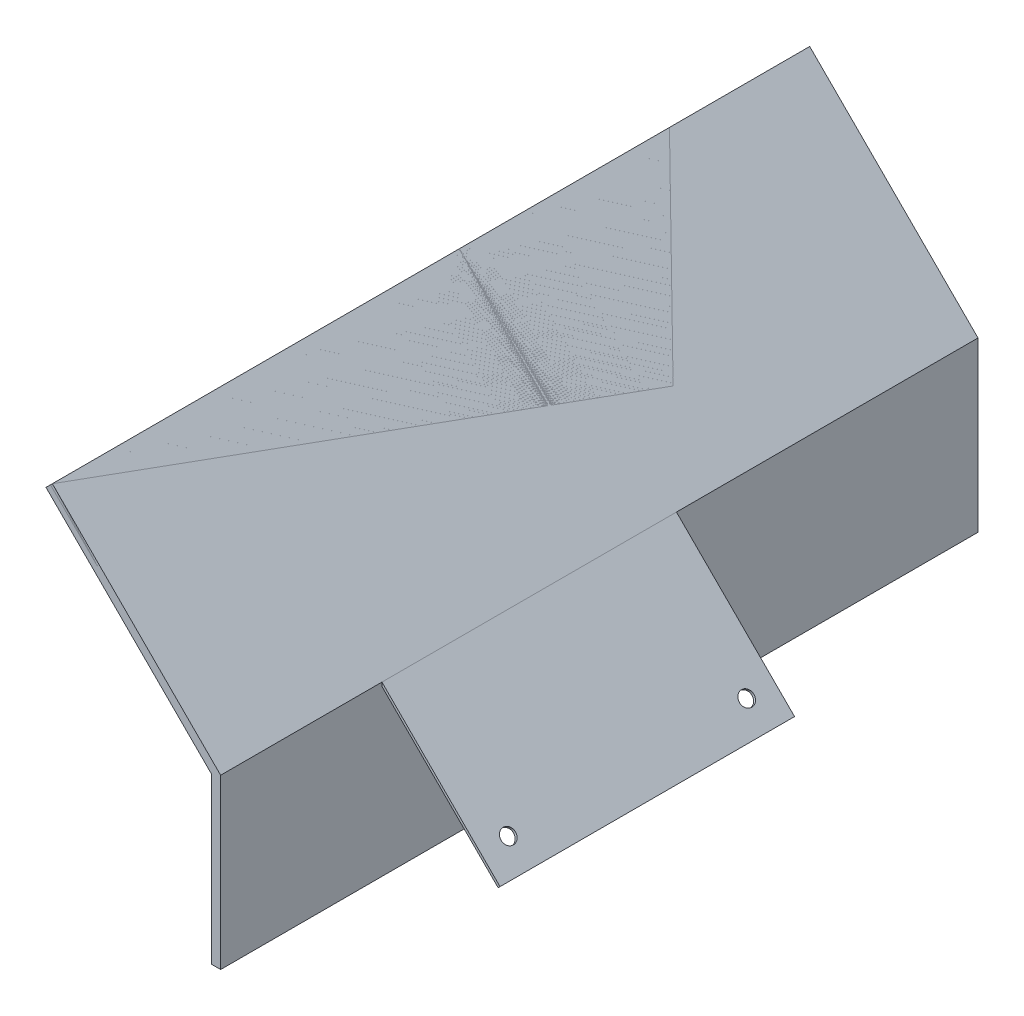
ISO-10303-21;
HEADER;
FILE_DESCRIPTION(('STEP AP214'),'2;1');
FILE_NAME('part.step','',(''),(''),'','','');
FILE_SCHEMA(('AUTOMOTIVE_DESIGN { 1 0 10303 214 1 1 1 1 }'));
ENDSEC;
DATA;
#1=APPLICATION_CONTEXT('core data for automotive mechanical design processes');
#2=APPLICATION_PROTOCOL_DEFINITION('international standard','automotive_design',2000,#1);
#3=PRODUCT_CONTEXT('',#1,'mechanical');
#4=PRODUCT('Part','Part','',(#3));
#5=PRODUCT_RELATED_PRODUCT_CATEGORY('part','',(#4));
#6=PRODUCT_DEFINITION_FORMATION('','',#4);
#7=PRODUCT_DEFINITION_CONTEXT('part definition',#1,'design');
#8=PRODUCT_DEFINITION('design','',#6,#7);
#9=PRODUCT_DEFINITION_SHAPE('','',#8);
#10=(LENGTH_UNIT() NAMED_UNIT(*) SI_UNIT(.MILLI.,.METRE.));
#11=(NAMED_UNIT(*) PLANE_ANGLE_UNIT() SI_UNIT($,.RADIAN.));
#12=(NAMED_UNIT(*) SI_UNIT($,.STERADIAN.) SOLID_ANGLE_UNIT());
#13=UNCERTAINTY_MEASURE_WITH_UNIT(LENGTH_MEASURE(1.E-05),#10,'distance_accuracy_value','');
#14=(GEOMETRIC_REPRESENTATION_CONTEXT(3) GLOBAL_UNCERTAINTY_ASSIGNED_CONTEXT((#13)) GLOBAL_UNIT_ASSIGNED_CONTEXT((#10,
#11,#12)) REPRESENTATION_CONTEXT('',''));
#15=CARTESIAN_POINT('',(0.,0.,0.));
#16=DIRECTION('',(0.,0.,1.));
#17=DIRECTION('',(1.,0.,0.));
#18=AXIS2_PLACEMENT_3D('',#15,#16,#17);
#19=CARTESIAN_POINT('',(-44.1236816385379,-78.9253169424674,-73.025));
#20=DIRECTION('',(0.,0.,-1.));
#21=DIRECTION('',(-0.707106781186546,-0.707106781186549,0.));
#22=AXIS2_PLACEMENT_3D('',#19,#20,#21);
#23=PLANE('',#22);
#24=DIRECTION('',(-0.707106781186549,0.707106781186546,0.));
#25=VECTOR('',#24,1.);
#26=CARTESIAN_POINT('',(57.5328176519647,22.7311823480355,-73.025));
#27=LINE('',#26,#25);
#28=CARTESIAN_POINT('',(57.5328176519647,22.7311823480355,-73.025));
#29=VERTEX_POINT('',#28);
#30=CARTESIAN_POINT('',(3.33641809728114,76.9275819027189,-73.025));
#31=VERTEX_POINT('',#30);
#32=EDGE_CURVE('E185',#29,#31,#27,.T.);
#33=ORIENTED_EDGE('',*,*,#32,.T.);
#34=DIRECTION('',(1.,0.,0.));
#35=VECTOR('',#34,1.);
#36=CARTESIAN_POINT('',(-139.7,76.9275819027189,-73.025));
#37=LINE('',#36,#35);
#38=CARTESIAN_POINT('',(1.61939312693272,76.9275819027189,-73.025));
#39=VERTEX_POINT('',#38);
#40=EDGE_CURVE('E151',#39,#31,#37,.T.);
#41=ORIENTED_EDGE('',*,*,#40,.F.);
#42=DIRECTION('',(-0.707106781186549,0.707106781186546,0.));
#43=VECTOR('',#42,1.);
#44=CARTESIAN_POINT('',(56.6743051667905,21.8726698628613,-73.025));
#45=LINE('',#44,#43);
#46=CARTESIAN_POINT('',(56.6743051667905,21.8726698628613,-73.025));
#47=VERTEX_POINT('',#46);
#48=EDGE_CURVE('E183',#47,#39,#45,.T.);
#49=ORIENTED_EDGE('',*,*,#48,.F.);
#50=DIRECTION('',(0.707106781186546,0.707106781186549,0.));
#51=VECTOR('',#50,1.);
#52=CARTESIAN_POINT('',(-44.1236816385379,-78.9253169424674,-73.025));
#53=LINE('',#52,#51);
#54=EDGE_CURVE('E181',#47,#29,#53,.T.);
#55=ORIENTED_EDGE('',*,*,#54,.T.);
#56=EDGE_LOOP('',(#33,#41,#49,#55));
#57=FACE_BOUND('',#56,.T.);
#58=ADVANCED_FACE('F59',(#57),#23,.F.);
#59=CARTESIAN_POINT('',(57.5328176519647,22.7311823480355,-342.9));
#60=DIRECTION('',(-0.707106781186549,0.707106781186546,0.));
#61=DIRECTION('',(0.,0.,1.));
#62=AXIS2_PLACEMENT_3D('',#59,#60,#61);
#63=PLANE('',#62);
#64=DIRECTION('',(0.707106781186546,0.707106781186549,0.));
#65=VECTOR('',#64,1.);
#66=CARTESIAN_POINT('',(-44.1236816385379,-78.9253169424675,-206.375));
#67=LINE('',#66,#65);
#68=CARTESIAN_POINT('',(56.6743051667905,21.8726698628613,-206.375));
#69=VERTEX_POINT('',#68);
#70=CARTESIAN_POINT('',(57.5328176519647,22.7311823480355,-206.375));
#71=VERTEX_POINT('',#70);
#72=EDGE_CURVE('E175',#69,#71,#67,.T.);
#73=ORIENTED_EDGE('',*,*,#72,.T.);
#74=DIRECTION('',(0.,0.,1.));
#75=VECTOR('',#74,1.);
#76=CARTESIAN_POINT('',(57.5328176519647,22.7311823480355,-342.9));
#77=LINE('',#76,#75);
#78=EDGE_CURVE('E13',#71,#29,#77,.T.);
#79=ORIENTED_EDGE('',*,*,#78,.T.);
#80=ORIENTED_EDGE('',*,*,#54,.F.);
#81=DIRECTION('',(0.,0.,1.));
#82=VECTOR('',#81,1.);
#83=CARTESIAN_POINT('',(56.6743051667905,21.8726698628613,-342.9));
#84=LINE('',#83,#82);
#85=EDGE_CURVE('E63',#69,#47,#84,.T.);
#86=ORIENTED_EDGE('',*,*,#85,.F.);
#87=EDGE_LOOP('',(#73,#79,#80,#86));
#88=FACE_BOUND('',#87,.T.);
#89=ADVANCED_FACE('F216',(#88),#63,.F.);
#90=CARTESIAN_POINT('',(4.06400000000002,76.2,-342.9));
#91=DIRECTION('',(0.707106781186546,0.707106781186549,0.));
#92=DIRECTION('',(-0.707106781186549,0.707106781186546,0.));
#93=AXIS2_PLACEMENT_3D('',#90,#91,#92);
#94=PLANE('',#93);
#95=CARTESIAN_POINT('',(48.5525615308955,31.7114384691047,-193.675));
#96=DIRECTION('',(0.707106781186546,0.707106781186549,0.));
#97=DIRECTION('',(-0.707106781186549,0.707106781186546,0.));
#98=AXIS2_PLACEMENT_3D('',#95,#96,#97);
#99=CIRCLE('',#98,3.26389999999998);
#100=CARTESIAN_POINT('',(46.2446357077808,34.0193642922194,-193.675));
#101=VERTEX_POINT('',#100);
#102=EDGE_CURVE('E172',#101,#101,#99,.T.);
#103=ORIENTED_EDGE('',*,*,#102,.F.);
#104=EDGE_LOOP('',(#103));
#105=FACE_BOUND('',#104,.T.);
#106=CARTESIAN_POINT('',(48.5525615308955,31.7114384691047,-85.725));
#107=DIRECTION('',(0.707106781186546,0.707106781186549,0.));
#108=DIRECTION('',(-0.707106781186549,0.707106781186546,0.));
#109=AXIS2_PLACEMENT_3D('',#106,#107,#108);
#110=CIRCLE('',#109,3.26389999999999);
#111=CARTESIAN_POINT('',(46.2446357077808,34.0193642922194,-85.725));
#112=VERTEX_POINT('',#111);
#113=EDGE_CURVE('E165',#112,#112,#110,.T.);
#114=ORIENTED_EDGE('',*,*,#113,.F.);
#115=EDGE_LOOP('',(#114));
#116=FACE_BOUND('',#115,.T.);
#117=DIRECTION('',(0.707106781186549,-0.707106781186546,0.));
#118=VECTOR('',#117,1.);
#119=CARTESIAN_POINT('',(57.5328176519647,22.7311823480355,-206.375));
#120=LINE('',#119,#118);
#121=CARTESIAN_POINT('',(3.33641809728114,76.9275819027189,-206.375));
#122=VERTEX_POINT('',#121);
#123=EDGE_CURVE('E179',#122,#71,#120,.T.);
#124=ORIENTED_EDGE('',*,*,#123,.F.);
#125=DIRECTION('',(0.,0.,1.));
#126=VECTOR('',#125,1.);
#127=CARTESIAN_POINT('',(3.33641809728114,76.9275819027189,-342.9));
#128=LINE('',#127,#126);
#129=CARTESIAN_POINT('',(3.33641809728114,76.9275819027189,-279.4));
#130=VERTEX_POINT('',#129);
#131=EDGE_CURVE('E169',#122,#130,#128,.F.);
#132=ORIENTED_EDGE('',*,*,#131,.T.);
#133=DIRECTION('',(0.707106781186549,-0.707106781186546,0.));
#134=VECTOR('',#133,1.);
#135=CARTESIAN_POINT('',(4.06400000000002,76.2,-279.4));
#136=LINE('',#135,#134);
#137=CARTESIAN_POINT('',(-72.1360000000002,152.4,-279.4));
#138=VERTEX_POINT('',#137);
#139=EDGE_CURVE('E131',#138,#130,#136,.T.);
#140=ORIENTED_EDGE('',*,*,#139,.F.);
#141=DIRECTION('',(0.,0.,1.));
#142=VECTOR('',#141,1.);
#143=CARTESIAN_POINT('',(-72.1360000000002,152.4,-342.9));
#144=LINE('',#143,#142);
#145=CARTESIAN_POINT('',(-72.1360000000002,152.4,0.));
#146=VERTEX_POINT('',#145);
#147=EDGE_CURVE('E125',#138,#146,#144,.T.);
#148=ORIENTED_EDGE('',*,*,#147,.T.);
#149=DIRECTION('',(-0.707106781186549,0.707106781186546,0.));
#150=VECTOR('',#149,1.);
#151=CARTESIAN_POINT('',(4.06400000000002,76.2,0.));
#152=LINE('',#151,#150);
#153=CARTESIAN_POINT('',(3.33641809728115,76.9275819027189,0.));
#154=VERTEX_POINT('',#153);
#155=EDGE_CURVE('E129',#154,#146,#152,.T.);
#156=ORIENTED_EDGE('',*,*,#155,.F.);
#157=EDGE_CURVE('E134',#154,#31,#128,.F.);
#158=ORIENTED_EDGE('',*,*,#157,.T.);
#159=ORIENTED_EDGE('',*,*,#32,.F.);
#160=ORIENTED_EDGE('',*,*,#78,.F.);
#161=EDGE_LOOP('',(#124,#132,#140,#148,#156,#158,#159,#160));
#162=FACE_BOUND('',#161,.T.);
#163=ADVANCED_FACE('F61',(#105,#116,#162),#94,.T.);
#164=CARTESIAN_POINT('',(56.6743051667905,21.8726698628613,-342.9));
#165=DIRECTION('',(0.707106781186546,0.707106781186549,0.));
#166=DIRECTION('',(-0.707106781186549,0.707106781186546,0.));
#167=AXIS2_PLACEMENT_3D('',#164,#165,#166);
#168=PLANE('',#167);
#169=CARTESIAN_POINT('',(47.6940490457213,30.8529259839304,-193.675));
#170=DIRECTION('',(-0.707106781186546,-0.707106781186549,0.));
#171=DIRECTION('',(0.707106781186549,-0.707106781186546,0.));
#172=AXIS2_PLACEMENT_3D('',#169,#170,#171);
#173=CIRCLE('',#172,3.26389999999998);
#174=CARTESIAN_POINT('',(50.0019748688361,28.5450001608157,-193.675));
#175=VERTEX_POINT('',#174);
#176=EDGE_CURVE('E162',#175,#175,#173,.T.);
#177=ORIENTED_EDGE('',*,*,#176,.F.);
#178=EDGE_LOOP('',(#177));
#179=FACE_BOUND('',#178,.T.);
#180=CARTESIAN_POINT('',(47.6940490457213,30.8529259839304,-85.725));
#181=DIRECTION('',(-0.707106781186546,-0.707106781186549,0.));
#182=DIRECTION('',(0.707106781186549,-0.707106781186546,0.));
#183=AXIS2_PLACEMENT_3D('',#180,#181,#182);
#184=CIRCLE('',#183,3.26389999999999);
#185=CARTESIAN_POINT('',(50.0019748688361,28.5450001608157,-85.725));
#186=VERTEX_POINT('',#185);
#187=EDGE_CURVE('E166',#186,#186,#184,.T.);
#188=ORIENTED_EDGE('',*,*,#187,.F.);
#189=EDGE_LOOP('',(#188));
#190=FACE_BOUND('',#189,.T.);
#191=ORIENTED_EDGE('',*,*,#48,.T.);
#192=DIRECTION('',(0.,0.,-1.));
#193=VECTOR('',#192,1.);
#194=CARTESIAN_POINT('',(1.61939312693272,76.9275819027189,-342.9));
#195=LINE('',#194,#193);
#196=CARTESIAN_POINT('',(1.61939312693273,76.9275819027189,0.));
#197=VERTEX_POINT('',#196);
#198=EDGE_CURVE('E156',#197,#39,#195,.T.);
#199=ORIENTED_EDGE('',*,*,#198,.F.);
#200=DIRECTION('',(-0.707106781186549,0.707106781186546,0.));
#201=VECTOR('',#200,1.);
#202=CARTESIAN_POINT('',(3.20548751482581,75.3414875148258,0.));
#203=LINE('',#202,#201);
#204=CARTESIAN_POINT('',(-72.9945124851745,151.541487514826,0.));
#205=VERTEX_POINT('',#204);
#206=EDGE_CURVE('E194',#197,#205,#203,.T.);
#207=ORIENTED_EDGE('',*,*,#206,.T.);
#208=DIRECTION('',(0.,0.,1.));
#209=VECTOR('',#208,1.);
#210=CARTESIAN_POINT('',(-72.9945124851745,151.541487514826,-342.9));
#211=LINE('',#210,#209);
#212=CARTESIAN_POINT('',(-72.9945124851745,151.541487514826,-279.4));
#213=VERTEX_POINT('',#212);
#214=EDGE_CURVE('E140',#213,#205,#211,.T.);
#215=ORIENTED_EDGE('',*,*,#214,.F.);
#216=DIRECTION('',(0.707106781186549,-0.707106781186546,0.));
#217=VECTOR('',#216,1.);
#218=CARTESIAN_POINT('',(3.20548751482581,75.3414875148258,-279.4));
#219=LINE('',#218,#217);
#220=CARTESIAN_POINT('',(1.61939312693272,76.9275819027189,-279.4));
#221=VERTEX_POINT('',#220);
#222=EDGE_CURVE('E200',#213,#221,#219,.T.);
#223=ORIENTED_EDGE('',*,*,#222,.T.);
#224=DIRECTION('',(0.,0.,1.));
#225=VECTOR('',#224,1.);
#226=CARTESIAN_POINT('',(1.61939312693272,76.9275819027189,-342.9));
#227=LINE('',#226,#225);
#228=CARTESIAN_POINT('',(1.61939312693273,76.9275819027189,-206.375));
#229=VERTEX_POINT('',#228);
#230=EDGE_CURVE('E196',#221,#229,#227,.T.);
#231=ORIENTED_EDGE('',*,*,#230,.T.);
#232=DIRECTION('',(0.707106781186549,-0.707106781186546,0.));
#233=VECTOR('',#232,1.);
#234=CARTESIAN_POINT('',(56.6743051667905,21.8726698628613,-206.375));
#235=LINE('',#234,#233);
#236=EDGE_CURVE('E177',#229,#69,#235,.T.);
#237=ORIENTED_EDGE('',*,*,#236,.T.);
#238=ORIENTED_EDGE('',*,*,#85,.T.);
#239=EDGE_LOOP('',(#191,#199,#207,#215,#223,#231,#237,#238));
#240=FACE_BOUND('',#239,.T.);
#241=ADVANCED_FACE('F193',(#179,#190,#240),#168,.F.);
#242=CARTESIAN_POINT('',(-44.1236816385379,-78.9253169424675,-206.375));
#243=DIRECTION('',(0.,0.,1.));
#244=DIRECTION('',(0.707106781186546,0.707106781186549,0.));
#245=AXIS2_PLACEMENT_3D('',#242,#243,#244);
#246=PLANE('',#245);
#247=ORIENTED_EDGE('',*,*,#236,.F.);
#248=DIRECTION('',(1.,0.,0.));
#249=VECTOR('',#248,1.);
#250=CARTESIAN_POINT('',(-139.7,76.9275819027189,-206.375));
#251=LINE('',#250,#249);
#252=EDGE_CURVE('E144',#229,#122,#251,.T.);
#253=ORIENTED_EDGE('',*,*,#252,.T.);
#254=ORIENTED_EDGE('',*,*,#123,.T.);
#255=ORIENTED_EDGE('',*,*,#72,.F.);
#256=EDGE_LOOP('',(#247,#253,#254,#255));
#257=FACE_BOUND('',#256,.T.);
#258=ADVANCED_FACE('F210',(#257),#246,.F.);
#259=CARTESIAN_POINT('',(254.239939830311,237.398816768521,-85.725));
#260=DIRECTION('',(-0.707106781186546,-0.707106781186549,0.));
#261=DIRECTION('',(0.707106781186549,-0.707106781186546,0.));
#262=AXIS2_PLACEMENT_3D('',#259,#260,#261);
#263=CYLINDRICAL_SURFACE('',#262,3.26389999999999);
#264=ORIENTED_EDGE('',*,*,#113,.T.);
#265=EDGE_LOOP('',(#264));
#266=FACE_BOUND('',#265,.T.);
#267=ORIENTED_EDGE('',*,*,#187,.T.);
#268=EDGE_LOOP('',(#267));
#269=FACE_BOUND('',#268,.T.);
#270=ADVANCED_FACE('F230',(#266,#269),#263,.F.);
#271=CARTESIAN_POINT('',(254.239939830311,237.398816768521,-193.675));
#272=DIRECTION('',(-0.707106781186546,-0.707106781186549,0.));
#273=DIRECTION('',(0.707106781186549,-0.707106781186546,0.));
#274=AXIS2_PLACEMENT_3D('',#271,#272,#273);
#275=CYLINDRICAL_SURFACE('',#274,3.26389999999998);
#276=ORIENTED_EDGE('',*,*,#102,.T.);
#277=EDGE_LOOP('',(#276));
#278=FACE_BOUND('',#277,.T.);
#279=ORIENTED_EDGE('',*,*,#176,.T.);
#280=EDGE_LOOP('',(#279));
#281=FACE_BOUND('',#280,.T.);
#282=ADVANCED_FACE('F235',(#278,#281),#275,.F.);
#283=CARTESIAN_POINT('',(-139.7,76.9275819027189,-292.1));
#284=DIRECTION('',(0.,1.,0.));
#285=DIRECTION('',(0.,0.,1.));
#286=AXIS2_PLACEMENT_3D('',#283,#284,#285);
#287=PLANE('',#286);
#288=ORIENTED_EDGE('',*,*,#230,.F.);
#289=DIRECTION('',(1.,0.,0.));
#290=VECTOR('',#289,1.);
#291=CARTESIAN_POINT('',(-139.7,76.9275819027189,-279.4));
#292=LINE('',#291,#290);
#293=EDGE_CURVE('E159',#221,#130,#292,.T.);
#294=ORIENTED_EDGE('',*,*,#293,.T.);
#295=ORIENTED_EDGE('',*,*,#131,.F.);
#296=ORIENTED_EDGE('',*,*,#252,.F.);
#297=EDGE_LOOP('',(#288,#294,#295,#296));
#298=FACE_BOUND('',#297,.T.);
#299=ADVANCED_FACE('F213',(#298),#287,.F.);
#300=CARTESIAN_POINT('',(-139.7,76.9275819027189,0.));
#301=DIRECTION('',(0.,-1.,0.));
#302=DIRECTION('',(0.,0.,-1.));
#303=AXIS2_PLACEMENT_3D('',#300,#301,#302);
#304=PLANE('',#303);
#305=DIRECTION('',(1.,0.,0.));
#306=VECTOR('',#305,1.);
#307=CARTESIAN_POINT('',(-139.7,76.9275819027189,0.));
#308=LINE('',#307,#306);
#309=EDGE_CURVE('E148',#197,#154,#308,.T.);
#310=ORIENTED_EDGE('',*,*,#309,.F.);
#311=ORIENTED_EDGE('',*,*,#198,.T.);
#312=ORIENTED_EDGE('',*,*,#40,.T.);
#313=ORIENTED_EDGE('',*,*,#157,.F.);
#314=EDGE_LOOP('',(#310,#311,#312,#313));
#315=FACE_BOUND('',#314,.T.);
#316=ADVANCED_FACE('F191',(#315),#304,.T.);
#317=CARTESIAN_POINT('',(4.06400000000002,76.2,0.));
#318=DIRECTION('',(0.,0.,-1.));
#319=DIRECTION('',(-0.707106781186549,0.707106781186546,0.));
#320=AXIS2_PLACEMENT_3D('',#317,#318,#319);
#321=PLANE('',#320);
#322=ORIENTED_EDGE('',*,*,#206,.F.);
#323=ORIENTED_EDGE('',*,*,#309,.T.);
#324=ORIENTED_EDGE('',*,*,#155,.T.);
#325=DIRECTION('',(0.707106781186546,0.707106781186549,0.));
#326=VECTOR('',#325,1.);
#327=CARTESIAN_POINT('',(-72.1360000000002,152.4,0.));
#328=LINE('',#327,#326);
#329=EDGE_CURVE('E137',#205,#146,#328,.T.);
#330=ORIENTED_EDGE('',*,*,#329,.F.);
#331=EDGE_LOOP('',(#322,#323,#324,#330));
#332=FACE_BOUND('',#331,.T.);
#333=ADVANCED_FACE('F147',(#332),#321,.F.);
#334=CARTESIAN_POINT('',(-72.1360000000002,152.4,-342.9));
#335=DIRECTION('',(-0.707106781186549,0.707106781186546,0.));
#336=DIRECTION('',(0.,0.,1.));
#337=AXIS2_PLACEMENT_3D('',#334,#335,#336);
#338=PLANE('',#337);
#339=DIRECTION('',(0.707106781186546,0.707106781186549,0.));
#340=VECTOR('',#339,1.);
#341=CARTESIAN_POINT('',(-72.1360000000002,152.4,-279.4));
#342=LINE('',#341,#340);
#343=EDGE_CURVE('E195',#213,#138,#342,.T.);
#344=ORIENTED_EDGE('',*,*,#343,.F.);
#345=ORIENTED_EDGE('',*,*,#214,.T.);
#346=ORIENTED_EDGE('',*,*,#329,.T.);
#347=ORIENTED_EDGE('',*,*,#147,.F.);
#348=EDGE_LOOP('',(#344,#345,#346,#347));
#349=FACE_BOUND('',#348,.T.);
#350=ADVANCED_FACE('F138',(#349),#338,.T.);
#351=CARTESIAN_POINT('',(-75.0096819587424,76.9275819027189,-279.4));
#352=DIRECTION('',(0.,0.,1.));
#353=DIRECTION('',(1.,0.,0.));
#354=AXIS2_PLACEMENT_3D('',#351,#352,#353);
#355=PLANE('',#354);
#356=ORIENTED_EDGE('',*,*,#343,.T.);
#357=ORIENTED_EDGE('',*,*,#139,.T.);
#358=ORIENTED_EDGE('',*,*,#293,.F.);
#359=ORIENTED_EDGE('',*,*,#222,.F.);
#360=EDGE_LOOP('',(#356,#357,#358,#359));
#361=FACE_BOUND('',#360,.T.);
#362=ADVANCED_FACE('F215',(#361),#355,.F.);
#363=CLOSED_SHELL('',(#58,#89,#163,#241,#258,#270,#282,#299,#316,#333,#350,#362));
#364=MANIFOLD_SOLID_BREP('B2',#363);
#365=CARTESIAN_POINT('',(0.,74.5166360825157,-342.9));
#366=DIRECTION('',(-1.,0.,0.));
#367=DIRECTION('',(0.,0.,1.));
#368=AXIS2_PLACEMENT_3D('',#365,#366,#367);
#369=PLANE('',#368);
#370=DIRECTION('',(0.,-1.,0.));
#371=VECTOR('',#370,1.);
#372=CARTESIAN_POINT('',(0.,74.5166360825157,0.));
#373=LINE('',#372,#371);
#374=CARTESIAN_POINT('',(0.,74.5166360825157,0.));
#375=VERTEX_POINT('',#374);
#376=CARTESIAN_POINT('',(0.,0.,0.));
#377=VERTEX_POINT('',#376);
#378=EDGE_CURVE('E468',#375,#377,#373,.T.);
#379=ORIENTED_EDGE('',*,*,#378,.F.);
#380=DIRECTION('',(0.,0.,1.));
#381=VECTOR('',#380,1.);
#382=CARTESIAN_POINT('',(0.,74.5166360825157,-342.9));
#383=LINE('',#382,#381);
#384=CARTESIAN_POINT('',(0.,74.5166360825157,-342.9));
#385=VERTEX_POINT('',#384);
#386=EDGE_CURVE('E57',#385,#375,#383,.T.);
#387=ORIENTED_EDGE('',*,*,#386,.F.);
#388=DIRECTION('',(0.,-1.,0.));
#389=VECTOR('',#388,1.);
#390=CARTESIAN_POINT('',(0.,74.5166360825157,-342.9));
#391=LINE('',#390,#389);
#392=CARTESIAN_POINT('',(0.,0.,-342.9));
#393=VERTEX_POINT('',#392);
#394=EDGE_CURVE('E481',#385,#393,#391,.T.);
#395=ORIENTED_EDGE('',*,*,#394,.T.);
#396=DIRECTION('',(0.,0.,1.));
#397=VECTOR('',#396,1.);
#398=CARTESIAN_POINT('',(0.,0.,-342.9));
#399=LINE('',#398,#397);
#400=EDGE_CURVE('E382',#393,#377,#399,.T.);
#401=ORIENTED_EDGE('',*,*,#400,.T.);
#402=EDGE_LOOP('',(#379,#387,#395,#401));
#403=FACE_BOUND('',#402,.T.);
#404=ADVANCED_FACE('F379',(#403),#369,.T.);
#405=CARTESIAN_POINT('',(0.,74.5166360825157,-342.9));
#406=DIRECTION('',(-0.707106781186547,-0.707106781186548,0.));
#407=DIRECTION('',(0.707106781186548,-0.707106781186547,0.));
#408=AXIS2_PLACEMENT_3D('',#405,#406,#407);
#409=PLANE('',#408);
#410=DIRECTION('',(0.707106781186547,-0.707106781186547,0.));
#411=VECTOR('',#410,1.);
#412=CARTESIAN_POINT('',(0.,74.5166360825157,0.));
#413=LINE('',#412,#411);
#414=CARTESIAN_POINT('',(-75.0096819587424,149.526318041258,0.));
#415=VERTEX_POINT('',#414);
#416=EDGE_CURVE('E416',#415,#375,#413,.T.);
#417=ORIENTED_EDGE('',*,*,#416,.F.);
#418=DIRECTION('',(0.,0.,1.));
#419=VECTOR('',#418,1.);
#420=CARTESIAN_POINT('',(-75.0096819587424,149.526318041258,-342.9));
#421=LINE('',#420,#419);
#422=CARTESIAN_POINT('',(-75.0096819587424,149.526318041258,-342.9));
#423=VERTEX_POINT('',#422);
#424=EDGE_CURVE('E388',#423,#415,#421,.T.);
#425=ORIENTED_EDGE('',*,*,#424,.F.);
#426=DIRECTION('',(0.707106781186838,-0.707106781186257,0.));
#427=VECTOR('',#426,1.);
#428=CARTESIAN_POINT('',(-75.0096819587424,149.526318041258,-342.9));
#429=LINE('',#428,#427);
#430=EDGE_CURVE('E396',#423,#385,#429,.T.);
#431=ORIENTED_EDGE('',*,*,#430,.T.);
#432=ORIENTED_EDGE('',*,*,#386,.T.);
#433=EDGE_LOOP('',(#417,#425,#431,#432));
#434=FACE_BOUND('',#433,.T.);
#435=ADVANCED_FACE('F503',(#434),#409,.T.);
#436=CARTESIAN_POINT('',(-72.1360000000003,152.4,-342.9));
#437=DIRECTION('',(-0.707106781186551,0.707106781186544,0.));
#438=DIRECTION('',(-0.707106781186544,-0.707106781186551,0.));
#439=AXIS2_PLACEMENT_3D('',#436,#437,#438);
#440=PLANE('',#439);
#441=DIRECTION('',(-0.707106781186544,-0.707106781186551,0.));
#442=VECTOR('',#441,1.);
#443=CARTESIAN_POINT('',(-72.1360000000003,152.4,0.));
#444=LINE('',#443,#442);
#445=CARTESIAN_POINT('',(-72.1360000000003,152.4,0.));
#446=VERTEX_POINT('',#445);
#447=EDGE_CURVE('E441',#446,#415,#444,.T.);
#448=ORIENTED_EDGE('',*,*,#447,.F.);
#449=DIRECTION('',(0.,0.,1.));
#450=VECTOR('',#449,1.);
#451=CARTESIAN_POINT('',(-72.1360000000003,152.4,-342.9));
#452=LINE('',#451,#450);
#453=CARTESIAN_POINT('',(-72.1360000000003,152.4,-342.9));
#454=VERTEX_POINT('',#453);
#455=EDGE_CURVE('E436',#454,#446,#452,.T.);
#456=ORIENTED_EDGE('',*,*,#455,.F.);
#457=DIRECTION('',(-0.707106781186544,-0.707106781186551,0.));
#458=VECTOR('',#457,1.);
#459=CARTESIAN_POINT('',(-72.1360000000003,152.4,-342.9));
#460=LINE('',#459,#458);
#461=EDGE_CURVE('E439',#454,#423,#460,.T.);
#462=ORIENTED_EDGE('',*,*,#461,.T.);
#463=ORIENTED_EDGE('',*,*,#424,.T.);
#464=EDGE_LOOP('',(#448,#456,#462,#463));
#465=FACE_BOUND('',#464,.T.);
#466=ADVANCED_FACE('F438',(#465),#440,.T.);
#467=CARTESIAN_POINT('',(4.064,76.2,-342.9));
#468=DIRECTION('',(0.707106781186546,0.707106781186549,0.));
#469=DIRECTION('',(-0.707106781186549,0.707106781186546,0.));
#470=AXIS2_PLACEMENT_3D('',#467,#468,#469);
#471=PLANE('',#470);
#472=DIRECTION('',(-0.707106781186549,0.707106781186546,0.));
#473=VECTOR('',#472,1.);
#474=CARTESIAN_POINT('',(4.064,76.2,0.));
#475=LINE('',#474,#473);
#476=CARTESIAN_POINT('',(4.064,76.2,0.));
#477=VERTEX_POINT('',#476);
#478=EDGE_CURVE('E478',#477,#446,#475,.T.);
#479=ORIENTED_EDGE('',*,*,#478,.F.);
#480=DIRECTION('',(0.,0.,1.));
#481=VECTOR('',#480,1.);
#482=CARTESIAN_POINT('',(4.064,76.2,-342.9));
#483=LINE('',#482,#481);
#484=CARTESIAN_POINT('',(4.064,76.2,-342.9));
#485=VERTEX_POINT('',#484);
#486=EDGE_CURVE('E447',#485,#477,#483,.T.);
#487=ORIENTED_EDGE('',*,*,#486,.F.);
#488=DIRECTION('',(-0.707106781186549,0.707106781186546,0.));
#489=VECTOR('',#488,1.);
#490=CARTESIAN_POINT('',(4.064,76.2,-342.9));
#491=LINE('',#490,#489);
#492=EDGE_CURVE('E454',#485,#454,#491,.T.);
#493=ORIENTED_EDGE('',*,*,#492,.T.);
#494=ORIENTED_EDGE('',*,*,#455,.T.);
#495=EDGE_LOOP('',(#479,#487,#493,#494));
#496=FACE_BOUND('',#495,.T.);
#497=ADVANCED_FACE('F457',(#496),#471,.T.);
#498=CARTESIAN_POINT('',(4.06400000000001,0.,-342.9));
#499=DIRECTION('',(1.,0.,0.));
#500=DIRECTION('',(0.,1.,0.));
#501=AXIS2_PLACEMENT_3D('',#498,#499,#500);
#502=PLANE('',#501);
#503=DIRECTION('',(0.,1.,0.));
#504=VECTOR('',#503,1.);
#505=CARTESIAN_POINT('',(4.06400000000001,0.,0.));
#506=LINE('',#505,#504);
#507=CARTESIAN_POINT('',(4.06400000000001,0.,0.));
#508=VERTEX_POINT('',#507);
#509=EDGE_CURVE('E474',#508,#477,#506,.T.);
#510=ORIENTED_EDGE('',*,*,#509,.F.);
#511=DIRECTION('',(0.,0.,1.));
#512=VECTOR('',#511,1.);
#513=CARTESIAN_POINT('',(4.06400000000001,0.,-342.9));
#514=LINE('',#513,#512);
#515=CARTESIAN_POINT('',(4.06400000000001,0.,-342.9));
#516=VERTEX_POINT('',#515);
#517=EDGE_CURVE('E484',#516,#508,#514,.T.);
#518=ORIENTED_EDGE('',*,*,#517,.F.);
#519=DIRECTION('',(0.,1.,0.));
#520=VECTOR('',#519,1.);
#521=CARTESIAN_POINT('',(4.06400000000001,0.,-342.9));
#522=LINE('',#521,#520);
#523=EDGE_CURVE('E459',#516,#485,#522,.T.);
#524=ORIENTED_EDGE('',*,*,#523,.T.);
#525=ORIENTED_EDGE('',*,*,#486,.T.);
#526=EDGE_LOOP('',(#510,#518,#524,#525));
#527=FACE_BOUND('',#526,.T.);
#528=ADVANCED_FACE('F493',(#527),#502,.T.);
#529=CARTESIAN_POINT('',(0.,0.,-342.9));
#530=DIRECTION('',(0.,-1.,0.));
#531=DIRECTION('',(0.,0.,-1.));
#532=AXIS2_PLACEMENT_3D('',#529,#530,#531);
#533=PLANE('',#532);
#534=DIRECTION('',(1.,0.,0.));
#535=VECTOR('',#534,1.);
#536=CARTESIAN_POINT('',(0.,0.,0.));
#537=LINE('',#536,#535);
#538=EDGE_CURVE('E471',#377,#508,#537,.T.);
#539=ORIENTED_EDGE('',*,*,#538,.F.);
#540=ORIENTED_EDGE('',*,*,#400,.F.);
#541=DIRECTION('',(1.,0.,0.));
#542=VECTOR('',#541,1.);
#543=CARTESIAN_POINT('',(0.,0.,-342.9));
#544=LINE('',#543,#542);
#545=EDGE_CURVE('E463',#393,#516,#544,.T.);
#546=ORIENTED_EDGE('',*,*,#545,.T.);
#547=ORIENTED_EDGE('',*,*,#517,.T.);
#548=EDGE_LOOP('',(#539,#540,#546,#547));
#549=FACE_BOUND('',#548,.T.);
#550=ADVANCED_FACE('F489',(#549),#533,.T.);
#551=CARTESIAN_POINT('',(0.,0.,-342.9));
#552=DIRECTION('',(0.,0.,1.));
#553=DIRECTION('',(1.,0.,0.));
#554=AXIS2_PLACEMENT_3D('',#551,#552,#553);
#555=PLANE('',#554);
#556=ORIENTED_EDGE('',*,*,#394,.F.);
#557=ORIENTED_EDGE('',*,*,#430,.F.);
#558=ORIENTED_EDGE('',*,*,#461,.F.);
#559=ORIENTED_EDGE('',*,*,#492,.F.);
#560=ORIENTED_EDGE('',*,*,#523,.F.);
#561=ORIENTED_EDGE('',*,*,#545,.F.);
#562=EDGE_LOOP('',(#556,#557,#558,#559,#560,#561));
#563=FACE_BOUND('',#562,.T.);
#564=ADVANCED_FACE('F452',(#563),#555,.F.);
#565=CARTESIAN_POINT('',(0.,0.,0.));
#566=DIRECTION('',(0.,0.,1.));
#567=DIRECTION('',(1.,0.,0.));
#568=AXIS2_PLACEMENT_3D('',#565,#566,#567);
#569=PLANE('',#568);
#570=ORIENTED_EDGE('',*,*,#378,.T.);
#571=ORIENTED_EDGE('',*,*,#538,.T.);
#572=ORIENTED_EDGE('',*,*,#509,.T.);
#573=ORIENTED_EDGE('',*,*,#478,.T.);
#574=ORIENTED_EDGE('',*,*,#447,.T.);
#575=ORIENTED_EDGE('',*,*,#416,.T.);
#576=EDGE_LOOP('',(#570,#571,#572,#573,#574,#575));
#577=FACE_BOUND('',#576,.T.);
#578=ADVANCED_FACE('F491',(#577),#569,.T.);
#579=CLOSED_SHELL('',(#404,#435,#466,#497,#528,#550,#564,#578));
#580=MANIFOLD_SOLID_BREP('B7_NOT_SHOWN',#579);
#581=ADVANCED_BREP_SHAPE_REPRESENTATION('',(#18,#364,#580),#14);
#582=SHAPE_DEFINITION_REPRESENTATION(#9,#581);
ENDSEC;
END-ISO-10303-21;
